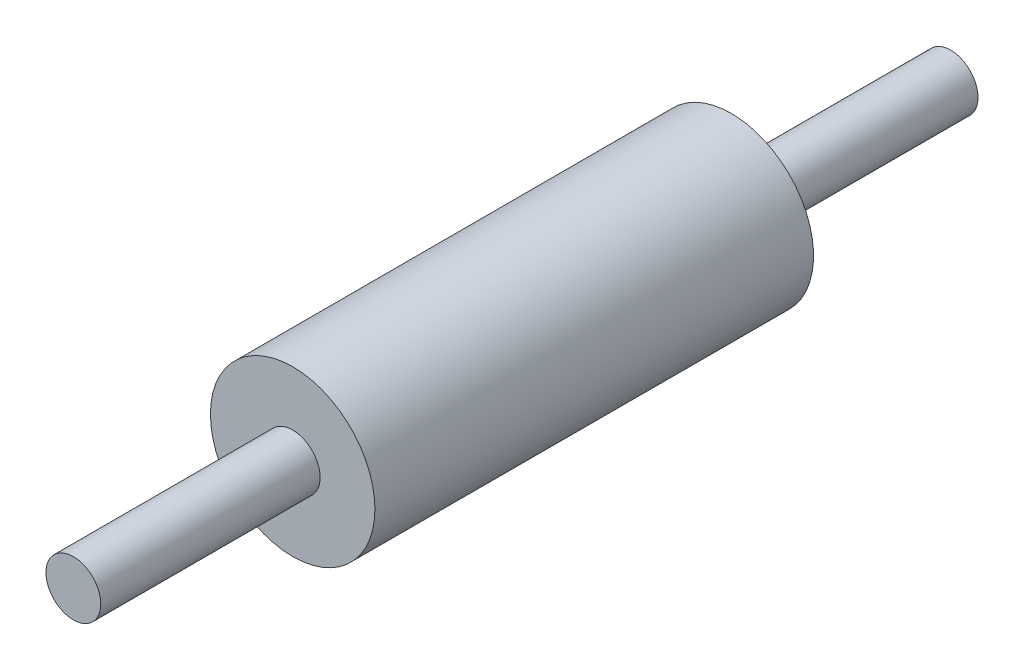
ISO-10303-21;
HEADER;
FILE_DESCRIPTION(('STEP AP214'),'2;1');
FILE_NAME('part.step','',(''),(''),'','','');
FILE_SCHEMA(('AUTOMOTIVE_DESIGN { 1 0 10303 214 1 1 1 1 }'));
ENDSEC;
DATA;
#1=APPLICATION_CONTEXT('core data for automotive mechanical design processes');
#2=APPLICATION_PROTOCOL_DEFINITION('international standard','automotive_design',2000,#1);
#3=PRODUCT_CONTEXT('',#1,'mechanical');
#4=PRODUCT('Part','Part','',(#3));
#5=PRODUCT_RELATED_PRODUCT_CATEGORY('part','',(#4));
#6=PRODUCT_DEFINITION_FORMATION('','',#4);
#7=PRODUCT_DEFINITION_CONTEXT('part definition',#1,'design');
#8=PRODUCT_DEFINITION('design','',#6,#7);
#9=PRODUCT_DEFINITION_SHAPE('','',#8);
#10=(LENGTH_UNIT() NAMED_UNIT(*) SI_UNIT(.MILLI.,.METRE.));
#11=(NAMED_UNIT(*) PLANE_ANGLE_UNIT() SI_UNIT($,.RADIAN.));
#12=(NAMED_UNIT(*) SI_UNIT($,.STERADIAN.) SOLID_ANGLE_UNIT());
#13=UNCERTAINTY_MEASURE_WITH_UNIT(LENGTH_MEASURE(1.E-05),#10,'distance_accuracy_value','');
#14=(GEOMETRIC_REPRESENTATION_CONTEXT(3) GLOBAL_UNCERTAINTY_ASSIGNED_CONTEXT((#13)) GLOBAL_UNIT_ASSIGNED_CONTEXT((#10,
#11,#12)) REPRESENTATION_CONTEXT('',''));
#15=CARTESIAN_POINT('',(0.,0.,0.));
#16=DIRECTION('',(0.,0.,1.));
#17=DIRECTION('',(1.,0.,0.));
#18=AXIS2_PLACEMENT_3D('',#15,#16,#17);
#19=CARTESIAN_POINT('',(0.,0.,160.));
#20=DIRECTION('',(0.,0.,-1.));
#21=DIRECTION('',(-1.,0.,0.));
#22=AXIS2_PLACEMENT_3D('',#19,#20,#21);
#23=CYLINDRICAL_SURFACE('',#22,15.);
#24=CARTESIAN_POINT('',(0.,0.,40.));
#25=DIRECTION('',(0.,0.,-1.));
#26=DIRECTION('',(-1.,0.,0.));
#27=AXIS2_PLACEMENT_3D('',#24,#25,#26);
#28=CIRCLE('',#27,15.);
#29=CARTESIAN_POINT('',(-15.,0.,40.));
#30=VERTEX_POINT('',#29);
#31=EDGE_CURVE('E11',#30,#30,#28,.T.);
#32=ORIENTED_EDGE('',*,*,#31,.F.);
#33=EDGE_LOOP('',(#32));
#34=FACE_BOUND('',#33,.T.);
#35=CARTESIAN_POINT('',(0.,0.,120.));
#36=DIRECTION('',(0.,0.,1.));
#37=DIRECTION('',(1.,0.,0.));
#38=AXIS2_PLACEMENT_3D('',#35,#36,#37);
#39=CIRCLE('',#38,15.);
#40=CARTESIAN_POINT('',(15.,0.,120.));
#41=VERTEX_POINT('',#40);
#42=EDGE_CURVE('E73',#41,#41,#39,.T.);
#43=ORIENTED_EDGE('',*,*,#42,.F.);
#44=EDGE_LOOP('',(#43));
#45=FACE_BOUND('',#44,.T.);
#46=ADVANCED_FACE('F55',(#34,#45),#23,.T.);
#47=CARTESIAN_POINT('',(0.,0.,40.));
#48=DIRECTION('',(0.,0.,-1.));
#49=DIRECTION('',(-1.,0.,0.));
#50=AXIS2_PLACEMENT_3D('',#47,#48,#49);
#51=PLANE('',#50);
#52=CARTESIAN_POINT('',(0.,0.,40.));
#53=DIRECTION('',(0.,0.,-1.));
#54=DIRECTION('',(-1.,0.,0.));
#55=AXIS2_PLACEMENT_3D('',#52,#53,#54);
#56=CIRCLE('',#55,5.);
#57=CARTESIAN_POINT('',(-5.,0.,40.));
#58=VERTEX_POINT('',#57);
#59=EDGE_CURVE('E62',#58,#58,#56,.T.);
#60=ORIENTED_EDGE('',*,*,#59,.F.);
#61=EDGE_LOOP('',(#60));
#62=FACE_BOUND('',#61,.T.);
#63=ORIENTED_EDGE('',*,*,#31,.T.);
#64=EDGE_LOOP('',(#63));
#65=FACE_BOUND('',#64,.T.);
#66=ADVANCED_FACE('F98',(#62,#65),#51,.T.);
#67=CARTESIAN_POINT('',(0.,0.,40.));
#68=DIRECTION('',(0.,0.,-1.));
#69=DIRECTION('',(-1.,0.,0.));
#70=AXIS2_PLACEMENT_3D('',#67,#68,#69);
#71=CYLINDRICAL_SURFACE('',#70,5.);
#72=ORIENTED_EDGE('',*,*,#59,.T.);
#73=EDGE_LOOP('',(#72));
#74=FACE_BOUND('',#73,.T.);
#75=CARTESIAN_POINT('',(0.,0.,0.));
#76=DIRECTION('',(0.,0.,-1.));
#77=DIRECTION('',(-1.,0.,0.));
#78=AXIS2_PLACEMENT_3D('',#75,#76,#77);
#79=CIRCLE('',#78,5.);
#80=CARTESIAN_POINT('',(-5.,0.,0.));
#81=VERTEX_POINT('',#80);
#82=EDGE_CURVE('E67',#81,#81,#79,.T.);
#83=ORIENTED_EDGE('',*,*,#82,.F.);
#84=EDGE_LOOP('',(#83));
#85=FACE_BOUND('',#84,.T.);
#86=ADVANCED_FACE('F104',(#74,#85),#71,.T.);
#87=CARTESIAN_POINT('',(0.,0.,0.));
#88=DIRECTION('',(0.,0.,1.));
#89=DIRECTION('',(1.,0.,0.));
#90=AXIS2_PLACEMENT_3D('',#87,#88,#89);
#91=PLANE('',#90);
#92=ORIENTED_EDGE('',*,*,#82,.T.);
#93=EDGE_LOOP('',(#92));
#94=FACE_BOUND('',#93,.T.);
#95=ADVANCED_FACE('F93',(#94),#91,.F.);
#96=CARTESIAN_POINT('',(0.,0.,120.));
#97=DIRECTION('',(0.,0.,1.));
#98=DIRECTION('',(1.,0.,0.));
#99=AXIS2_PLACEMENT_3D('',#96,#97,#98);
#100=PLANE('',#99);
#101=CARTESIAN_POINT('',(0.,0.,120.));
#102=DIRECTION('',(0.,0.,1.));
#103=DIRECTION('',(1.,0.,0.));
#104=AXIS2_PLACEMENT_3D('',#101,#102,#103);
#105=CIRCLE('',#104,5.);
#106=CARTESIAN_POINT('',(5.,0.,120.));
#107=VERTEX_POINT('',#106);
#108=EDGE_CURVE('E78',#107,#107,#105,.T.);
#109=ORIENTED_EDGE('',*,*,#108,.F.);
#110=EDGE_LOOP('',(#109));
#111=FACE_BOUND('',#110,.T.);
#112=ORIENTED_EDGE('',*,*,#42,.T.);
#113=EDGE_LOOP('',(#112));
#114=FACE_BOUND('',#113,.T.);
#115=ADVANCED_FACE('F90',(#111,#114),#100,.T.);
#116=CARTESIAN_POINT('',(0.,0.,120.));
#117=DIRECTION('',(0.,0.,1.));
#118=DIRECTION('',(1.,0.,0.));
#119=AXIS2_PLACEMENT_3D('',#116,#117,#118);
#120=CYLINDRICAL_SURFACE('',#119,5.);
#121=ORIENTED_EDGE('',*,*,#108,.T.);
#122=EDGE_LOOP('',(#121));
#123=FACE_BOUND('',#122,.T.);
#124=CARTESIAN_POINT('',(0.,0.,160.));
#125=DIRECTION('',(0.,0.,1.));
#126=DIRECTION('',(1.,0.,0.));
#127=AXIS2_PLACEMENT_3D('',#124,#125,#126);
#128=CIRCLE('',#127,5.);
#129=CARTESIAN_POINT('',(5.,0.,160.));
#130=VERTEX_POINT('',#129);
#131=EDGE_CURVE('E79',#130,#130,#128,.T.);
#132=ORIENTED_EDGE('',*,*,#131,.F.);
#133=EDGE_LOOP('',(#132));
#134=FACE_BOUND('',#133,.T.);
#135=ADVANCED_FACE('F87',(#123,#134),#120,.T.);
#136=CARTESIAN_POINT('',(0.,0.,160.));
#137=DIRECTION('',(0.,0.,1.));
#138=DIRECTION('',(1.,0.,0.));
#139=AXIS2_PLACEMENT_3D('',#136,#137,#138);
#140=PLANE('',#139);
#141=ORIENTED_EDGE('',*,*,#131,.T.);
#142=EDGE_LOOP('',(#141));
#143=FACE_BOUND('',#142,.T.);
#144=ADVANCED_FACE('F112',(#143),#140,.T.);
#145=CLOSED_SHELL('',(#46,#66,#86,#95,#115,#135,#144));
#146=MANIFOLD_SOLID_BREP('B2',#145);
#147=ADVANCED_BREP_SHAPE_REPRESENTATION('',(#18,#146),#14);
#148=SHAPE_DEFINITION_REPRESENTATION(#9,#147);
ENDSEC;
END-ISO-10303-21;
